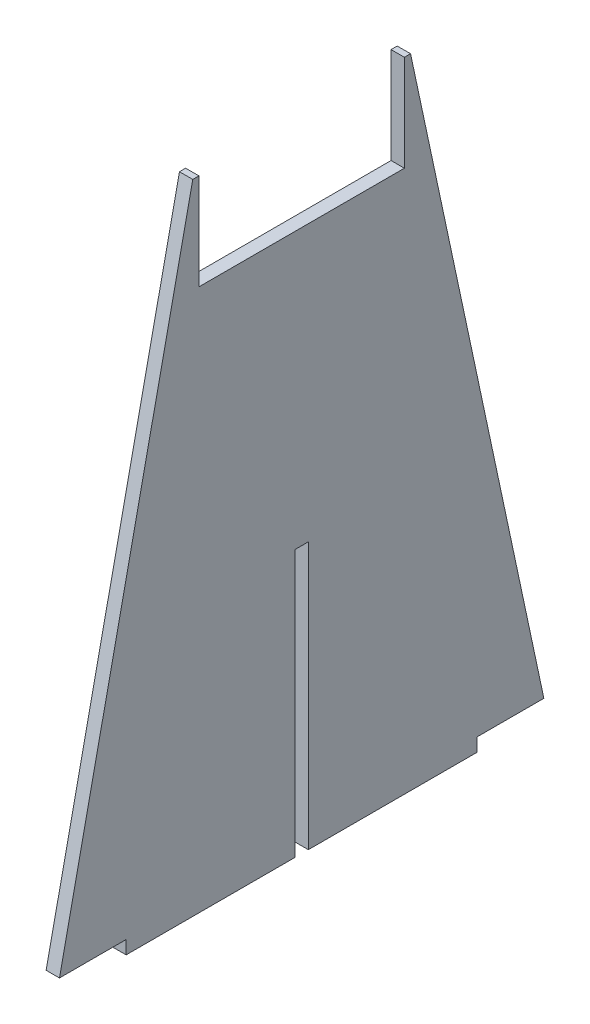
ISO-10303-21;
HEADER;
FILE_DESCRIPTION(('STEP AP214'),'2;1');
FILE_NAME('part.step','',(''),(''),'','','');
FILE_SCHEMA(('AUTOMOTIVE_DESIGN { 1 0 10303 214 1 1 1 1 }'));
ENDSEC;
DATA;
#1=APPLICATION_CONTEXT('core data for automotive mechanical design processes');
#2=APPLICATION_PROTOCOL_DEFINITION('international standard','automotive_design',2000,#1);
#3=PRODUCT_CONTEXT('',#1,'mechanical');
#4=PRODUCT('Part','Part','',(#3));
#5=PRODUCT_RELATED_PRODUCT_CATEGORY('part','',(#4));
#6=PRODUCT_DEFINITION_FORMATION('','',#4);
#7=PRODUCT_DEFINITION_CONTEXT('part definition',#1,'design');
#8=PRODUCT_DEFINITION('design','',#6,#7);
#9=PRODUCT_DEFINITION_SHAPE('','',#8);
#10=(LENGTH_UNIT() NAMED_UNIT(*) SI_UNIT(.MILLI.,.METRE.));
#11=(NAMED_UNIT(*) PLANE_ANGLE_UNIT() SI_UNIT($,.RADIAN.));
#12=(NAMED_UNIT(*) SI_UNIT($,.STERADIAN.) SOLID_ANGLE_UNIT());
#13=UNCERTAINTY_MEASURE_WITH_UNIT(LENGTH_MEASURE(1.E-05),#10,'distance_accuracy_value','');
#14=(GEOMETRIC_REPRESENTATION_CONTEXT(3) GLOBAL_UNCERTAINTY_ASSIGNED_CONTEXT((#13)) GLOBAL_UNIT_ASSIGNED_CONTEXT((#10,
#11,#12)) REPRESENTATION_CONTEXT('',''));
#15=CARTESIAN_POINT('',(0.,0.,0.));
#16=DIRECTION('',(0.,0.,1.));
#17=DIRECTION('',(1.,0.,0.));
#18=AXIS2_PLACEMENT_3D('',#15,#16,#17);
#19=CARTESIAN_POINT('',(3.,0.,39.5));
#20=DIRECTION('',(0.,0.,-1.));
#21=DIRECTION('',(-1.,0.,0.));
#22=AXIS2_PLACEMENT_3D('',#19,#20,#21);
#23=PLANE('',#22);
#24=DIRECTION('',(0.,-1.,0.));
#25=VECTOR('',#24,1.);
#26=CARTESIAN_POINT('',(0.,0.,39.5));
#27=LINE('',#26,#25);
#28=CARTESIAN_POINT('',(0.,0.,39.5));
#29=VERTEX_POINT('',#28);
#30=CARTESIAN_POINT('',(0.,-3.,39.5));
#31=VERTEX_POINT('',#30);
#32=EDGE_CURVE('E192',#29,#31,#27,.T.);
#33=ORIENTED_EDGE('',*,*,#32,.T.);
#34=DIRECTION('',(-1.,0.,0.));
#35=VECTOR('',#34,1.);
#36=CARTESIAN_POINT('',(3.,-3.,39.5));
#37=LINE('',#36,#35);
#38=CARTESIAN_POINT('',(3.,-3.,39.5));
#39=VERTEX_POINT('',#38);
#40=EDGE_CURVE('E11',#39,#31,#37,.T.);
#41=ORIENTED_EDGE('',*,*,#40,.F.);
#42=DIRECTION('',(0.,-1.,0.));
#43=VECTOR('',#42,1.);
#44=CARTESIAN_POINT('',(3.,0.,39.5));
#45=LINE('',#44,#43);
#46=CARTESIAN_POINT('',(3.,0.,39.5));
#47=VERTEX_POINT('',#46);
#48=EDGE_CURVE('E193',#47,#39,#45,.T.);
#49=ORIENTED_EDGE('',*,*,#48,.F.);
#50=DIRECTION('',(-1.,0.,0.));
#51=VECTOR('',#50,1.);
#52=CARTESIAN_POINT('',(3.,0.,39.5));
#53=LINE('',#52,#51);
#54=EDGE_CURVE('E218',#47,#29,#53,.T.);
#55=ORIENTED_EDGE('',*,*,#54,.T.);
#56=EDGE_LOOP('',(#33,#41,#49,#55));
#57=FACE_BOUND('',#56,.T.);
#58=ADVANCED_FACE('F37',(#57),#23,.F.);
#59=CARTESIAN_POINT('',(3.,-3.,39.5));
#60=DIRECTION('',(0.,1.,0.));
#61=DIRECTION('',(0.,0.,1.));
#62=AXIS2_PLACEMENT_3D('',#59,#60,#61);
#63=PLANE('',#62);
#64=DIRECTION('',(0.,0.,-1.));
#65=VECTOR('',#64,1.);
#66=CARTESIAN_POINT('',(0.,-3.,39.5));
#67=LINE('',#66,#65);
#68=CARTESIAN_POINT('',(0.,-3.,1.50000000000001));
#69=VERTEX_POINT('',#68);
#70=EDGE_CURVE('E221',#31,#69,#67,.T.);
#71=ORIENTED_EDGE('',*,*,#70,.T.);
#72=DIRECTION('',(-1.,0.,0.));
#73=VECTOR('',#72,1.);
#74=CARTESIAN_POINT('',(3.,-3.,1.50000000000001));
#75=LINE('',#74,#73);
#76=CARTESIAN_POINT('',(3.,-3.,1.50000000000001));
#77=VERTEX_POINT('',#76);
#78=EDGE_CURVE('E44',#77,#69,#75,.T.);
#79=ORIENTED_EDGE('',*,*,#78,.F.);
#80=DIRECTION('',(0.,0.,-1.));
#81=VECTOR('',#80,1.);
#82=CARTESIAN_POINT('',(3.,-3.,39.5));
#83=LINE('',#82,#81);
#84=EDGE_CURVE('E196',#39,#77,#83,.T.);
#85=ORIENTED_EDGE('',*,*,#84,.F.);
#86=ORIENTED_EDGE('',*,*,#40,.T.);
#87=EDGE_LOOP('',(#71,#79,#85,#86));
#88=FACE_BOUND('',#87,.T.);
#89=ADVANCED_FACE('F284',(#88),#63,.F.);
#90=CARTESIAN_POINT('',(3.,57.,1.50000000000001));
#91=DIRECTION('',(0.,0.,1.));
#92=DIRECTION('',(1.,0.,0.));
#93=AXIS2_PLACEMENT_3D('',#90,#91,#92);
#94=PLANE('',#93);
#95=DIRECTION('',(0.,1.,0.));
#96=VECTOR('',#95,1.);
#97=CARTESIAN_POINT('',(0.,57.,1.50000000000001));
#98=LINE('',#97,#96);
#99=CARTESIAN_POINT('',(0.,57.,1.50000000000001));
#100=VERTEX_POINT('',#99);
#101=EDGE_CURVE('E223',#69,#100,#98,.T.);
#102=ORIENTED_EDGE('',*,*,#101,.T.);
#103=DIRECTION('',(-1.,0.,0.));
#104=VECTOR('',#103,1.);
#105=CARTESIAN_POINT('',(3.,57.,1.50000000000001));
#106=LINE('',#105,#104);
#107=CARTESIAN_POINT('',(3.,57.,1.50000000000001));
#108=VERTEX_POINT('',#107);
#109=EDGE_CURVE('E258',#108,#100,#106,.T.);
#110=ORIENTED_EDGE('',*,*,#109,.F.);
#111=DIRECTION('',(0.,1.,0.));
#112=VECTOR('',#111,1.);
#113=CARTESIAN_POINT('',(3.,57.,1.50000000000001));
#114=LINE('',#113,#112);
#115=EDGE_CURVE('E199',#77,#108,#114,.T.);
#116=ORIENTED_EDGE('',*,*,#115,.F.);
#117=ORIENTED_EDGE('',*,*,#78,.T.);
#118=EDGE_LOOP('',(#102,#110,#116,#117));
#119=FACE_BOUND('',#118,.T.);
#120=ADVANCED_FACE('F265',(#119),#94,.F.);
#121=CARTESIAN_POINT('',(3.,57.,-1.50000000000001));
#122=DIRECTION('',(0.,1.,0.));
#123=DIRECTION('',(0.,0.,1.));
#124=AXIS2_PLACEMENT_3D('',#121,#122,#123);
#125=PLANE('',#124);
#126=DIRECTION('',(0.,0.,-1.));
#127=VECTOR('',#126,1.);
#128=CARTESIAN_POINT('',(0.,57.,-1.50000000000001));
#129=LINE('',#128,#127);
#130=CARTESIAN_POINT('',(0.,57.,-1.50000000000001));
#131=VERTEX_POINT('',#130);
#132=EDGE_CURVE('E225',#100,#131,#129,.T.);
#133=ORIENTED_EDGE('',*,*,#132,.T.);
#134=DIRECTION('',(-1.,0.,0.));
#135=VECTOR('',#134,1.);
#136=CARTESIAN_POINT('',(3.,57.,-1.50000000000001));
#137=LINE('',#136,#135);
#138=CARTESIAN_POINT('',(3.,57.,-1.50000000000001));
#139=VERTEX_POINT('',#138);
#140=EDGE_CURVE('E255',#139,#131,#137,.T.);
#141=ORIENTED_EDGE('',*,*,#140,.F.);
#142=DIRECTION('',(0.,0.,-1.));
#143=VECTOR('',#142,1.);
#144=CARTESIAN_POINT('',(3.,57.,-1.50000000000001));
#145=LINE('',#144,#143);
#146=EDGE_CURVE('E201',#108,#139,#145,.T.);
#147=ORIENTED_EDGE('',*,*,#146,.F.);
#148=ORIENTED_EDGE('',*,*,#109,.T.);
#149=EDGE_LOOP('',(#133,#141,#147,#148));
#150=FACE_BOUND('',#149,.T.);
#151=ADVANCED_FACE('F273',(#150),#125,.F.);
#152=CARTESIAN_POINT('',(3.,-3.,-1.50000000000001));
#153=DIRECTION('',(0.,0.,-1.));
#154=DIRECTION('',(-1.,0.,0.));
#155=AXIS2_PLACEMENT_3D('',#152,#153,#154);
#156=PLANE('',#155);
#157=DIRECTION('',(0.,-1.,0.));
#158=VECTOR('',#157,1.);
#159=CARTESIAN_POINT('',(0.,-3.,-1.50000000000001));
#160=LINE('',#159,#158);
#161=CARTESIAN_POINT('',(0.,-3.,-1.50000000000001));
#162=VERTEX_POINT('',#161);
#163=EDGE_CURVE('E227',#131,#162,#160,.T.);
#164=ORIENTED_EDGE('',*,*,#163,.T.);
#165=DIRECTION('',(-1.,0.,0.));
#166=VECTOR('',#165,1.);
#167=CARTESIAN_POINT('',(3.,-3.,-1.50000000000001));
#168=LINE('',#167,#166);
#169=CARTESIAN_POINT('',(3.,-3.,-1.50000000000001));
#170=VERTEX_POINT('',#169);
#171=EDGE_CURVE('E252',#170,#162,#168,.T.);
#172=ORIENTED_EDGE('',*,*,#171,.F.);
#173=DIRECTION('',(0.,-1.,0.));
#174=VECTOR('',#173,1.);
#175=CARTESIAN_POINT('',(3.,-3.,-1.50000000000001));
#176=LINE('',#175,#174);
#177=EDGE_CURVE('E203',#139,#170,#176,.T.);
#178=ORIENTED_EDGE('',*,*,#177,.F.);
#179=ORIENTED_EDGE('',*,*,#140,.T.);
#180=EDGE_LOOP('',(#164,#172,#178,#179));
#181=FACE_BOUND('',#180,.T.);
#182=ADVANCED_FACE('F277',(#181),#156,.F.);
#183=CARTESIAN_POINT('',(3.,-3.,-39.5));
#184=DIRECTION('',(0.,1.,0.));
#185=DIRECTION('',(0.,0.,1.));
#186=AXIS2_PLACEMENT_3D('',#183,#184,#185);
#187=PLANE('',#186);
#188=DIRECTION('',(0.,0.,-1.));
#189=VECTOR('',#188,1.);
#190=CARTESIAN_POINT('',(0.,-3.,-39.5));
#191=LINE('',#190,#189);
#192=CARTESIAN_POINT('',(0.,-3.,-39.5));
#193=VERTEX_POINT('',#192);
#194=EDGE_CURVE('E229',#162,#193,#191,.T.);
#195=ORIENTED_EDGE('',*,*,#194,.T.);
#196=DIRECTION('',(-1.,0.,0.));
#197=VECTOR('',#196,1.);
#198=CARTESIAN_POINT('',(3.,-3.,-39.5));
#199=LINE('',#198,#197);
#200=CARTESIAN_POINT('',(3.,-3.,-39.5));
#201=VERTEX_POINT('',#200);
#202=EDGE_CURVE('E249',#201,#193,#199,.T.);
#203=ORIENTED_EDGE('',*,*,#202,.F.);
#204=DIRECTION('',(0.,0.,-1.));
#205=VECTOR('',#204,1.);
#206=CARTESIAN_POINT('',(3.,-3.,-39.5));
#207=LINE('',#206,#205);
#208=EDGE_CURVE('E205',#170,#201,#207,.T.);
#209=ORIENTED_EDGE('',*,*,#208,.F.);
#210=ORIENTED_EDGE('',*,*,#171,.T.);
#211=EDGE_LOOP('',(#195,#203,#209,#210));
#212=FACE_BOUND('',#211,.T.);
#213=ADVANCED_FACE('F325',(#212),#187,.F.);
#214=CARTESIAN_POINT('',(3.,0.,-39.5));
#215=DIRECTION('',(0.,0.,1.));
#216=DIRECTION('',(1.,0.,0.));
#217=AXIS2_PLACEMENT_3D('',#214,#215,#216);
#218=PLANE('',#217);
#219=DIRECTION('',(0.,1.,0.));
#220=VECTOR('',#219,1.);
#221=CARTESIAN_POINT('',(0.,0.,-39.5));
#222=LINE('',#221,#220);
#223=CARTESIAN_POINT('',(0.,0.,-39.5));
#224=VERTEX_POINT('',#223);
#225=EDGE_CURVE('E231',#193,#224,#222,.T.);
#226=ORIENTED_EDGE('',*,*,#225,.T.);
#227=DIRECTION('',(-1.,0.,0.));
#228=VECTOR('',#227,1.);
#229=CARTESIAN_POINT('',(3.,0.,-39.5));
#230=LINE('',#229,#228);
#231=CARTESIAN_POINT('',(3.,0.,-39.5));
#232=VERTEX_POINT('',#231);
#233=EDGE_CURVE('E246',#232,#224,#230,.T.);
#234=ORIENTED_EDGE('',*,*,#233,.F.);
#235=DIRECTION('',(0.,1.,0.));
#236=VECTOR('',#235,1.);
#237=CARTESIAN_POINT('',(3.,0.,-39.5));
#238=LINE('',#237,#236);
#239=EDGE_CURVE('E207',#201,#232,#238,.T.);
#240=ORIENTED_EDGE('',*,*,#239,.F.);
#241=ORIENTED_EDGE('',*,*,#202,.T.);
#242=EDGE_LOOP('',(#226,#234,#240,#241));
#243=FACE_BOUND('',#242,.T.);
#244=ADVANCED_FACE('F328',(#243),#218,.F.);
#245=CARTESIAN_POINT('',(3.,0.,-54.5));
#246=DIRECTION('',(0.,1.,0.));
#247=DIRECTION('',(0.,0.,1.));
#248=AXIS2_PLACEMENT_3D('',#245,#246,#247);
#249=PLANE('',#248);
#250=DIRECTION('',(0.,0.,-1.));
#251=VECTOR('',#250,1.);
#252=CARTESIAN_POINT('',(0.,0.,-54.5));
#253=LINE('',#252,#251);
#254=CARTESIAN_POINT('',(0.,0.,-54.5));
#255=VERTEX_POINT('',#254);
#256=EDGE_CURVE('E233',#224,#255,#253,.T.);
#257=ORIENTED_EDGE('',*,*,#256,.T.);
#258=DIRECTION('',(-1.,0.,0.));
#259=VECTOR('',#258,1.);
#260=CARTESIAN_POINT('',(3.,0.,-54.5));
#261=LINE('',#260,#259);
#262=CARTESIAN_POINT('',(3.,0.,-54.5));
#263=VERTEX_POINT('',#262);
#264=EDGE_CURVE('E243',#263,#255,#261,.T.);
#265=ORIENTED_EDGE('',*,*,#264,.F.);
#266=DIRECTION('',(0.,0.,-1.));
#267=VECTOR('',#266,1.);
#268=CARTESIAN_POINT('',(3.,0.,-54.5));
#269=LINE('',#268,#267);
#270=EDGE_CURVE('E209',#232,#263,#269,.T.);
#271=ORIENTED_EDGE('',*,*,#270,.F.);
#272=ORIENTED_EDGE('',*,*,#233,.T.);
#273=EDGE_LOOP('',(#257,#265,#271,#272));
#274=FACE_BOUND('',#273,.T.);
#275=ADVANCED_FACE('F332',(#274),#249,.F.);
#276=CARTESIAN_POINT('',(3.,0.,-54.5));
#277=DIRECTION('',(0.,-0.208638471770519,0.977992836424307));
#278=DIRECTION('',(0.,-0.977992836424308,-0.208638471770519));
#279=AXIS2_PLACEMENT_3D('',#276,#277,#278);
#280=PLANE('',#279);
#281=DIRECTION('',(0.,0.977992836424308,0.208638471770519));
#282=VECTOR('',#281,1.);
#283=CARTESIAN_POINT('',(0.,0.,-54.5));
#284=LINE('',#283,#282);
#285=CARTESIAN_POINT('',(0.,140.625,-24.5));
#286=VERTEX_POINT('',#285);
#287=EDGE_CURVE('E160',#255,#286,#284,.T.);
#288=ORIENTED_EDGE('',*,*,#287,.T.);
#289=DIRECTION('',(1.,0.,0.));
#290=VECTOR('',#289,1.);
#291=CARTESIAN_POINT('',(-22.4419389759441,140.625,-24.5));
#292=LINE('',#291,#290);
#293=CARTESIAN_POINT('',(3.,140.625,-24.5));
#294=VERTEX_POINT('',#293);
#295=EDGE_CURVE('E512',#286,#294,#292,.T.);
#296=ORIENTED_EDGE('',*,*,#295,.T.);
#297=DIRECTION('',(0.,0.977992836424308,0.208638471770519));
#298=VECTOR('',#297,1.);
#299=CARTESIAN_POINT('',(3.,0.,-54.5));
#300=LINE('',#299,#298);
#301=EDGE_CURVE('E211',#263,#294,#300,.T.);
#302=ORIENTED_EDGE('',*,*,#301,.F.);
#303=ORIENTED_EDGE('',*,*,#264,.T.);
#304=EDGE_LOOP('',(#288,#296,#302,#303));
#305=FACE_BOUND('',#304,.T.);
#306=ADVANCED_FACE('F336',(#305),#280,.F.);
#307=CARTESIAN_POINT('',(3.,119.,-29.1133333333333));
#308=DIRECTION('',(0.,-1.,0.));
#309=DIRECTION('',(0.,0.,-1.));
#310=AXIS2_PLACEMENT_3D('',#307,#308,#309);
#311=PLANE('',#310);
#312=DIRECTION('',(0.,0.,1.));
#313=VECTOR('',#312,1.);
#314=CARTESIAN_POINT('',(3.,119.,-29.1133333333333));
#315=LINE('',#314,#313);
#316=CARTESIAN_POINT('',(3.,119.,-23.1133333333333));
#317=VERTEX_POINT('',#316);
#318=CARTESIAN_POINT('',(3.,119.,23.1133333333333));
#319=VERTEX_POINT('',#318);
#320=EDGE_CURVE('E51',#317,#319,#315,.T.);
#321=ORIENTED_EDGE('',*,*,#320,.F.);
#322=DIRECTION('',(1.,0.,0.));
#323=VECTOR('',#322,1.);
#324=CARTESIAN_POINT('',(-22.4419389759441,119.,-23.1133333333333));
#325=LINE('',#324,#323);
#326=CARTESIAN_POINT('',(0.,119.,-23.1133333333333));
#327=VERTEX_POINT('',#326);
#328=EDGE_CURVE('E162',#327,#317,#325,.T.);
#329=ORIENTED_EDGE('',*,*,#328,.F.);
#330=DIRECTION('',(0.,0.,1.));
#331=VECTOR('',#330,1.);
#332=CARTESIAN_POINT('',(0.,119.,-29.1133333333333));
#333=LINE('',#332,#331);
#334=CARTESIAN_POINT('',(0.,119.,23.1133333333333));
#335=VERTEX_POINT('',#334);
#336=EDGE_CURVE('E149',#327,#335,#333,.T.);
#337=ORIENTED_EDGE('',*,*,#336,.T.);
#338=DIRECTION('',(1.,0.,0.));
#339=VECTOR('',#338,1.);
#340=CARTESIAN_POINT('',(-22.4419389759441,119.,23.1133333333333));
#341=LINE('',#340,#339);
#342=EDGE_CURVE('E185',#335,#319,#341,.T.);
#343=ORIENTED_EDGE('',*,*,#342,.T.);
#344=EDGE_LOOP('',(#321,#329,#337,#343));
#345=FACE_BOUND('',#344,.T.);
#346=ADVANCED_FACE('F163',(#345),#311,.F.);
#347=CARTESIAN_POINT('',(3.,0.,54.5));
#348=DIRECTION('',(0.,-0.208638471770519,-0.977992836424307));
#349=DIRECTION('',(0.,0.977992836424308,-0.208638471770519));
#350=AXIS2_PLACEMENT_3D('',#347,#348,#349);
#351=PLANE('',#350);
#352=DIRECTION('',(0.,-0.977992836424308,0.208638471770519));
#353=VECTOR('',#352,1.);
#354=CARTESIAN_POINT('',(0.,0.,54.5));
#355=LINE('',#354,#353);
#356=CARTESIAN_POINT('',(0.,140.625,24.5));
#357=VERTEX_POINT('',#356);
#358=CARTESIAN_POINT('',(0.,0.,54.5));
#359=VERTEX_POINT('',#358);
#360=EDGE_CURVE('E159',#357,#359,#355,.T.);
#361=ORIENTED_EDGE('',*,*,#360,.T.);
#362=DIRECTION('',(-1.,0.,0.));
#363=VECTOR('',#362,1.);
#364=CARTESIAN_POINT('',(3.,0.,54.5));
#365=LINE('',#364,#363);
#366=CARTESIAN_POINT('',(3.,0.,54.5));
#367=VERTEX_POINT('',#366);
#368=EDGE_CURVE('E240',#367,#359,#365,.T.);
#369=ORIENTED_EDGE('',*,*,#368,.F.);
#370=DIRECTION('',(0.,-0.977992836424308,0.208638471770519));
#371=VECTOR('',#370,1.);
#372=CARTESIAN_POINT('',(3.,0.,54.5));
#373=LINE('',#372,#371);
#374=CARTESIAN_POINT('',(3.,140.625,24.5));
#375=VERTEX_POINT('',#374);
#376=EDGE_CURVE('E214',#375,#367,#373,.T.);
#377=ORIENTED_EDGE('',*,*,#376,.F.);
#378=DIRECTION('',(1.,0.,0.));
#379=VECTOR('',#378,1.);
#380=CARTESIAN_POINT('',(-22.4419389759441,140.625,24.5));
#381=LINE('',#380,#379);
#382=EDGE_CURVE('E179',#357,#375,#381,.T.);
#383=ORIENTED_EDGE('',*,*,#382,.F.);
#384=EDGE_LOOP('',(#361,#369,#377,#383));
#385=FACE_BOUND('',#384,.T.);
#386=ADVANCED_FACE('F294',(#385),#351,.F.);
#387=CARTESIAN_POINT('',(3.,0.,54.5));
#388=DIRECTION('',(0.,1.,0.));
#389=DIRECTION('',(0.,0.,1.));
#390=AXIS2_PLACEMENT_3D('',#387,#388,#389);
#391=PLANE('',#390);
#392=DIRECTION('',(0.,0.,-1.));
#393=VECTOR('',#392,1.);
#394=CARTESIAN_POINT('',(0.,0.,54.5));
#395=LINE('',#394,#393);
#396=EDGE_CURVE('E197',#359,#29,#395,.T.);
#397=ORIENTED_EDGE('',*,*,#396,.T.);
#398=ORIENTED_EDGE('',*,*,#54,.F.);
#399=DIRECTION('',(0.,0.,-1.));
#400=VECTOR('',#399,1.);
#401=CARTESIAN_POINT('',(3.,0.,54.5));
#402=LINE('',#401,#400);
#403=EDGE_CURVE('E216',#367,#47,#402,.T.);
#404=ORIENTED_EDGE('',*,*,#403,.F.);
#405=ORIENTED_EDGE('',*,*,#368,.T.);
#406=EDGE_LOOP('',(#397,#398,#404,#405));
#407=FACE_BOUND('',#406,.T.);
#408=ADVANCED_FACE('F290',(#407),#391,.F.);
#409=CARTESIAN_POINT('',(3.,0.,0.));
#410=DIRECTION('',(1.,0.,0.));
#411=DIRECTION('',(0.,0.,-1.));
#412=AXIS2_PLACEMENT_3D('',#409,#410,#411);
#413=PLANE('',#412);
#414=ORIENTED_EDGE('',*,*,#48,.T.);
#415=ORIENTED_EDGE('',*,*,#84,.T.);
#416=ORIENTED_EDGE('',*,*,#115,.T.);
#417=ORIENTED_EDGE('',*,*,#146,.T.);
#418=ORIENTED_EDGE('',*,*,#177,.T.);
#419=ORIENTED_EDGE('',*,*,#208,.T.);
#420=ORIENTED_EDGE('',*,*,#239,.T.);
#421=ORIENTED_EDGE('',*,*,#270,.T.);
#422=ORIENTED_EDGE('',*,*,#301,.T.);
#423=DIRECTION('',(0.,0.,1.));
#424=VECTOR('',#423,1.);
#425=CARTESIAN_POINT('',(3.,140.625,-24.5));
#426=LINE('',#425,#424);
#427=CARTESIAN_POINT('',(3.,140.625,-23.1133333333333));
#428=VERTEX_POINT('',#427);
#429=EDGE_CURVE('E174',#294,#428,#426,.T.);
#430=ORIENTED_EDGE('',*,*,#429,.T.);
#431=DIRECTION('',(0.,-1.,0.));
#432=VECTOR('',#431,1.);
#433=CARTESIAN_POINT('',(3.,140.625,-23.1133333333333));
#434=LINE('',#433,#432);
#435=EDGE_CURVE('E521',#428,#317,#434,.T.);
#436=ORIENTED_EDGE('',*,*,#435,.T.);
#437=ORIENTED_EDGE('',*,*,#320,.T.);
#438=DIRECTION('',(0.,1.,0.));
#439=VECTOR('',#438,1.);
#440=CARTESIAN_POINT('',(3.,140.625,23.1133333333333));
#441=LINE('',#440,#439);
#442=CARTESIAN_POINT('',(3.,140.625,23.1133333333333));
#443=VERTEX_POINT('',#442);
#444=EDGE_CURVE('E180',#319,#443,#441,.T.);
#445=ORIENTED_EDGE('',*,*,#444,.T.);
#446=DIRECTION('',(0.,0.,1.));
#447=VECTOR('',#446,1.);
#448=CARTESIAN_POINT('',(3.,140.625,24.5));
#449=LINE('',#448,#447);
#450=EDGE_CURVE('E182',#443,#375,#449,.T.);
#451=ORIENTED_EDGE('',*,*,#450,.T.);
#452=ORIENTED_EDGE('',*,*,#376,.T.);
#453=ORIENTED_EDGE('',*,*,#403,.T.);
#454=EDGE_LOOP('',(#414,#415,#416,#417,#418,#419,#420,#421,#422,#430,#436,#437,#445,#451,#452,#453));
#455=FACE_BOUND('',#454,.T.);
#456=ADVANCED_FACE('F280',(#455),#413,.T.);
#457=CARTESIAN_POINT('',(0.,0.,0.));
#458=DIRECTION('',(1.,0.,0.));
#459=DIRECTION('',(0.,0.,-1.));
#460=AXIS2_PLACEMENT_3D('',#457,#458,#459);
#461=PLANE('',#460);
#462=ORIENTED_EDGE('',*,*,#32,.F.);
#463=ORIENTED_EDGE('',*,*,#396,.F.);
#464=ORIENTED_EDGE('',*,*,#360,.F.);
#465=DIRECTION('',(0.,0.,-1.));
#466=VECTOR('',#465,1.);
#467=CARTESIAN_POINT('',(0.,140.625,24.5));
#468=LINE('',#467,#466);
#469=CARTESIAN_POINT('',(0.,140.625,23.1133333333333));
#470=VERTEX_POINT('',#469);
#471=EDGE_CURVE('E177',#357,#470,#468,.T.);
#472=ORIENTED_EDGE('',*,*,#471,.T.);
#473=DIRECTION('',(0.,-1.,0.));
#474=VECTOR('',#473,1.);
#475=CARTESIAN_POINT('',(0.,140.625,23.1133333333333));
#476=LINE('',#475,#474);
#477=EDGE_CURVE('E157',#470,#335,#476,.T.);
#478=ORIENTED_EDGE('',*,*,#477,.T.);
#479=ORIENTED_EDGE('',*,*,#336,.F.);
#480=DIRECTION('',(0.,1.,0.));
#481=VECTOR('',#480,1.);
#482=CARTESIAN_POINT('',(0.,140.625,-23.1133333333333));
#483=LINE('',#482,#481);
#484=CARTESIAN_POINT('',(0.,140.625,-23.1133333333333));
#485=VERTEX_POINT('',#484);
#486=EDGE_CURVE('E154',#327,#485,#483,.T.);
#487=ORIENTED_EDGE('',*,*,#486,.T.);
#488=DIRECTION('',(0.,0.,-1.));
#489=VECTOR('',#488,1.);
#490=CARTESIAN_POINT('',(0.,140.625,-24.5));
#491=LINE('',#490,#489);
#492=EDGE_CURVE('E167',#485,#286,#491,.T.);
#493=ORIENTED_EDGE('',*,*,#492,.T.);
#494=ORIENTED_EDGE('',*,*,#287,.F.);
#495=ORIENTED_EDGE('',*,*,#256,.F.);
#496=ORIENTED_EDGE('',*,*,#225,.F.);
#497=ORIENTED_EDGE('',*,*,#194,.F.);
#498=ORIENTED_EDGE('',*,*,#163,.F.);
#499=ORIENTED_EDGE('',*,*,#132,.F.);
#500=ORIENTED_EDGE('',*,*,#101,.F.);
#501=ORIENTED_EDGE('',*,*,#70,.F.);
#502=EDGE_LOOP('',(#462,#463,#464,#472,#478,#479,#487,#493,#494,#495,#496,#497,#498,#499,#500,#501));
#503=FACE_BOUND('',#502,.T.);
#504=ADVANCED_FACE('F151',(#503),#461,.F.);
#505=CARTESIAN_POINT('',(-22.4419389759441,140.625,24.5));
#506=DIRECTION('',(0.,1.,0.));
#507=DIRECTION('',(0.,0.,1.));
#508=AXIS2_PLACEMENT_3D('',#505,#506,#507);
#509=PLANE('',#508);
#510=ORIENTED_EDGE('',*,*,#471,.F.);
#511=ORIENTED_EDGE('',*,*,#382,.T.);
#512=ORIENTED_EDGE('',*,*,#450,.F.);
#513=DIRECTION('',(1.,0.,0.));
#514=VECTOR('',#513,1.);
#515=CARTESIAN_POINT('',(-22.4419389759441,140.625,23.1133333333333));
#516=LINE('',#515,#514);
#517=EDGE_CURVE('E188',#470,#443,#516,.T.);
#518=ORIENTED_EDGE('',*,*,#517,.F.);
#519=EDGE_LOOP('',(#510,#511,#512,#518));
#520=FACE_BOUND('',#519,.T.);
#521=ADVANCED_FACE('F298',(#520),#509,.T.);
#522=CARTESIAN_POINT('',(-22.4419389759441,140.625,23.1133333333333));
#523=DIRECTION('',(0.,0.,-1.));
#524=DIRECTION('',(0.,1.,0.));
#525=AXIS2_PLACEMENT_3D('',#522,#523,#524);
#526=PLANE('',#525);
#527=ORIENTED_EDGE('',*,*,#477,.F.);
#528=ORIENTED_EDGE('',*,*,#517,.T.);
#529=ORIENTED_EDGE('',*,*,#444,.F.);
#530=ORIENTED_EDGE('',*,*,#342,.F.);
#531=EDGE_LOOP('',(#527,#528,#529,#530));
#532=FACE_BOUND('',#531,.T.);
#533=ADVANCED_FACE('F301',(#532),#526,.T.);
#534=CARTESIAN_POINT('',(-22.4419389759441,140.625,-23.1133333333333));
#535=DIRECTION('',(0.,0.,1.));
#536=DIRECTION('',(0.,-1.,0.));
#537=AXIS2_PLACEMENT_3D('',#534,#535,#536);
#538=PLANE('',#537);
#539=ORIENTED_EDGE('',*,*,#486,.F.);
#540=ORIENTED_EDGE('',*,*,#328,.T.);
#541=ORIENTED_EDGE('',*,*,#435,.F.);
#542=DIRECTION('',(1.,0.,0.));
#543=VECTOR('',#542,1.);
#544=CARTESIAN_POINT('',(-22.4419389759441,140.625,-23.1133333333333));
#545=LINE('',#544,#543);
#546=EDGE_CURVE('E166',#485,#428,#545,.T.);
#547=ORIENTED_EDGE('',*,*,#546,.F.);
#548=EDGE_LOOP('',(#539,#540,#541,#547));
#549=FACE_BOUND('',#548,.T.);
#550=ADVANCED_FACE('F170',(#549),#538,.T.);
#551=CARTESIAN_POINT('',(-22.4419389759441,140.625,-24.5));
#552=DIRECTION('',(0.,1.,0.));
#553=DIRECTION('',(0.,0.,1.));
#554=AXIS2_PLACEMENT_3D('',#551,#552,#553);
#555=PLANE('',#554);
#556=ORIENTED_EDGE('',*,*,#492,.F.);
#557=ORIENTED_EDGE('',*,*,#546,.T.);
#558=ORIENTED_EDGE('',*,*,#429,.F.);
#559=ORIENTED_EDGE('',*,*,#295,.F.);
#560=EDGE_LOOP('',(#556,#557,#558,#559));
#561=FACE_BOUND('',#560,.T.);
#562=ADVANCED_FACE('F308',(#561),#555,.T.);
#563=CLOSED_SHELL('',(#58,#89,#120,#151,#182,#213,#244,#275,#306,#346,#386,#408,#456,#504,#521,
#533,#550,#562));
#564=MANIFOLD_SOLID_BREP('B2',#563);
#565=ADVANCED_BREP_SHAPE_REPRESENTATION('',(#18,#564),#14);
#566=SHAPE_DEFINITION_REPRESENTATION(#9,#565);
ENDSEC;
END-ISO-10303-21;
